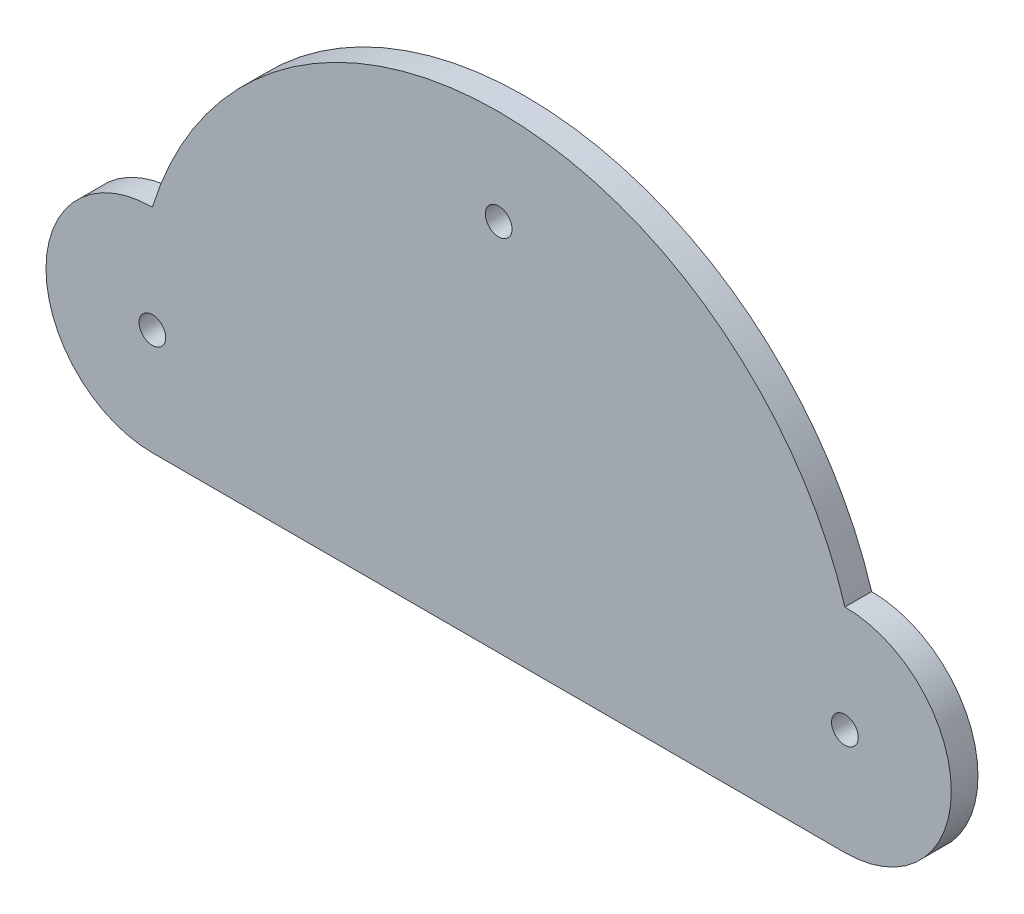
ISO-10303-21;
HEADER;
FILE_DESCRIPTION(('STEP AP214'),'2;1');
FILE_NAME('part.step','',(''),(''),'','','');
FILE_SCHEMA(('AUTOMOTIVE_DESIGN { 1 0 10303 214 1 1 1 1 }'));
ENDSEC;
DATA;
#1=APPLICATION_CONTEXT('core data for automotive mechanical design processes');
#2=APPLICATION_PROTOCOL_DEFINITION('international standard','automotive_design',2000,#1);
#3=PRODUCT_CONTEXT('',#1,'mechanical');
#4=PRODUCT('Part','Part','',(#3));
#5=PRODUCT_RELATED_PRODUCT_CATEGORY('part','',(#4));
#6=PRODUCT_DEFINITION_FORMATION('','',#4);
#7=PRODUCT_DEFINITION_CONTEXT('part definition',#1,'design');
#8=PRODUCT_DEFINITION('design','',#6,#7);
#9=PRODUCT_DEFINITION_SHAPE('','',#8);
#10=(LENGTH_UNIT() NAMED_UNIT(*) SI_UNIT(.MILLI.,.METRE.));
#11=(NAMED_UNIT(*) PLANE_ANGLE_UNIT() SI_UNIT($,.RADIAN.));
#12=(NAMED_UNIT(*) SI_UNIT($,.STERADIAN.) SOLID_ANGLE_UNIT());
#13=UNCERTAINTY_MEASURE_WITH_UNIT(LENGTH_MEASURE(1.E-05),#10,'distance_accuracy_value','');
#14=(GEOMETRIC_REPRESENTATION_CONTEXT(3) GLOBAL_UNCERTAINTY_ASSIGNED_CONTEXT((#13)) GLOBAL_UNIT_ASSIGNED_CONTEXT((#10,
#11,#12)) REPRESENTATION_CONTEXT('',''));
#15=CARTESIAN_POINT('',(0.,0.,0.));
#16=DIRECTION('',(0.,0.,1.));
#17=DIRECTION('',(1.,0.,0.));
#18=AXIS2_PLACEMENT_3D('',#15,#16,#17);
#19=CARTESIAN_POINT('',(38.89,0.,3.));
#20=DIRECTION('',(0.,0.,1.));
#21=DIRECTION('',(1.,0.,0.));
#22=AXIS2_PLACEMENT_3D('',#19,#20,#21);
#23=PLANE('',#22);
#24=CARTESIAN_POINT('',(77.78,0.,3.));
#25=DIRECTION('',(0.,0.,1.));
#26=DIRECTION('',(1.,0.,0.));
#27=AXIS2_PLACEMENT_3D('',#24,#25,#26);
#28=CIRCLE('',#27,1.5);
#29=CARTESIAN_POINT('',(79.28,0.,3.));
#30=VERTEX_POINT('',#29);
#31=EDGE_CURVE('E115',#30,#30,#28,.T.);
#32=ORIENTED_EDGE('',*,*,#31,.F.);
#33=EDGE_LOOP('',(#32));
#34=FACE_BOUND('',#33,.T.);
#35=CARTESIAN_POINT('',(38.89,0.,3.));
#36=DIRECTION('',(0.,0.,1.));
#37=DIRECTION('',(1.,0.,0.));
#38=AXIS2_PLACEMENT_3D('',#35,#36,#37);
#39=CIRCLE('',#38,40.6839116841608);
#40=CARTESIAN_POINT('',(77.78,11.9477432984057,3.));
#41=VERTEX_POINT('',#40);
#42=CARTESIAN_POINT('',(0.,11.9477432984057,3.));
#43=VERTEX_POINT('',#42);
#44=EDGE_CURVE('E85',#41,#43,#39,.T.);
#45=ORIENTED_EDGE('',*,*,#44,.T.);
#46=CARTESIAN_POINT('',(0.,0.,3.));
#47=DIRECTION('',(0.,0.,1.));
#48=DIRECTION('',(1.,0.,0.));
#49=AXIS2_PLACEMENT_3D('',#46,#47,#48);
#50=CIRCLE('',#49,11.9477432984057);
#51=CARTESIAN_POINT('',(0.,-11.9477432984057,3.));
#52=VERTEX_POINT('',#51);
#53=EDGE_CURVE('E80',#43,#52,#50,.T.);
#54=ORIENTED_EDGE('',*,*,#53,.T.);
#55=DIRECTION('',(1.,0.,0.));
#56=VECTOR('',#55,1.);
#57=CARTESIAN_POINT('',(0.,-11.9477432984057,3.));
#58=LINE('',#57,#56);
#59=CARTESIAN_POINT('',(77.78,-11.9477432984057,3.));
#60=VERTEX_POINT('',#59);
#61=EDGE_CURVE('E83',#52,#60,#58,.T.);
#62=ORIENTED_EDGE('',*,*,#61,.T.);
#63=CARTESIAN_POINT('',(77.78,0.,3.));
#64=DIRECTION('',(0.,0.,1.));
#65=DIRECTION('',(1.,0.,0.));
#66=AXIS2_PLACEMENT_3D('',#63,#64,#65);
#67=CIRCLE('',#66,11.9477432984057);
#68=EDGE_CURVE('E50',#60,#41,#67,.T.);
#69=ORIENTED_EDGE('',*,*,#68,.T.);
#70=EDGE_LOOP('',(#45,#54,#62,#69));
#71=FACE_BOUND('',#70,.T.);
#72=CARTESIAN_POINT('',(0.,0.,3.));
#73=DIRECTION('',(0.,0.,1.));
#74=DIRECTION('',(1.,0.,0.));
#75=AXIS2_PLACEMENT_3D('',#72,#73,#74);
#76=CIRCLE('',#75,1.5);
#77=CARTESIAN_POINT('',(1.5,0.,3.));
#78=VERTEX_POINT('',#77);
#79=EDGE_CURVE('E100',#78,#78,#76,.T.);
#80=ORIENTED_EDGE('',*,*,#79,.F.);
#81=EDGE_LOOP('',(#80));
#82=FACE_BOUND('',#81,.T.);
#83=CARTESIAN_POINT('',(38.89,30.,3.));
#84=DIRECTION('',(0.,0.,1.));
#85=DIRECTION('',(1.,0.,0.));
#86=AXIS2_PLACEMENT_3D('',#83,#84,#85);
#87=CIRCLE('',#86,1.5);
#88=CARTESIAN_POINT('',(40.39,30.,3.));
#89=VERTEX_POINT('',#88);
#90=EDGE_CURVE('E121',#89,#89,#87,.T.);
#91=ORIENTED_EDGE('',*,*,#90,.F.);
#92=EDGE_LOOP('',(#91));
#93=FACE_BOUND('',#92,.T.);
#94=ADVANCED_FACE('F33',(#34,#71,#82,#93),#23,.T.);
#95=CARTESIAN_POINT('',(38.89,0.,0.));
#96=DIRECTION('',(0.,0.,1.));
#97=DIRECTION('',(1.,0.,0.));
#98=AXIS2_PLACEMENT_3D('',#95,#96,#97);
#99=PLANE('',#98);
#100=CARTESIAN_POINT('',(38.89,0.,0.));
#101=DIRECTION('',(0.,0.,1.));
#102=DIRECTION('',(1.,0.,0.));
#103=AXIS2_PLACEMENT_3D('',#100,#101,#102);
#104=CIRCLE('',#103,40.6839116841608);
#105=CARTESIAN_POINT('',(77.78,11.9477432984057,0.));
#106=VERTEX_POINT('',#105);
#107=CARTESIAN_POINT('',(0.,11.9477432984057,0.));
#108=VERTEX_POINT('',#107);
#109=EDGE_CURVE('E97',#106,#108,#104,.T.);
#110=ORIENTED_EDGE('',*,*,#109,.F.);
#111=CARTESIAN_POINT('',(77.78,0.,0.));
#112=DIRECTION('',(0.,0.,1.));
#113=DIRECTION('',(1.,0.,0.));
#114=AXIS2_PLACEMENT_3D('',#111,#112,#113);
#115=CIRCLE('',#114,11.9477432984057);
#116=CARTESIAN_POINT('',(77.78,-11.9477432984057,0.));
#117=VERTEX_POINT('',#116);
#118=EDGE_CURVE('E73',#117,#106,#115,.T.);
#119=ORIENTED_EDGE('',*,*,#118,.F.);
#120=DIRECTION('',(1.,0.,0.));
#121=VECTOR('',#120,1.);
#122=CARTESIAN_POINT('',(0.,-11.9477432984057,0.));
#123=LINE('',#122,#121);
#124=CARTESIAN_POINT('',(0.,-11.9477432984057,0.));
#125=VERTEX_POINT('',#124);
#126=EDGE_CURVE('E67',#125,#117,#123,.T.);
#127=ORIENTED_EDGE('',*,*,#126,.F.);
#128=CARTESIAN_POINT('',(0.,0.,0.));
#129=DIRECTION('',(0.,0.,1.));
#130=DIRECTION('',(1.,0.,0.));
#131=AXIS2_PLACEMENT_3D('',#128,#129,#130);
#132=CIRCLE('',#131,11.9477432984057);
#133=EDGE_CURVE('E89',#108,#125,#132,.T.);
#134=ORIENTED_EDGE('',*,*,#133,.F.);
#135=EDGE_LOOP('',(#110,#119,#127,#134));
#136=FACE_BOUND('',#135,.T.);
#137=CARTESIAN_POINT('',(0.,0.,0.));
#138=DIRECTION('',(0.,0.,1.));
#139=DIRECTION('',(1.,0.,0.));
#140=AXIS2_PLACEMENT_3D('',#137,#138,#139);
#141=CIRCLE('',#140,1.5);
#142=CARTESIAN_POINT('',(1.5,0.,0.));
#143=VERTEX_POINT('',#142);
#144=EDGE_CURVE('E112',#143,#143,#141,.T.);
#145=ORIENTED_EDGE('',*,*,#144,.T.);
#146=EDGE_LOOP('',(#145));
#147=FACE_BOUND('',#146,.T.);
#148=CARTESIAN_POINT('',(77.78,0.,0.));
#149=DIRECTION('',(0.,0.,1.));
#150=DIRECTION('',(1.,0.,0.));
#151=AXIS2_PLACEMENT_3D('',#148,#149,#150);
#152=CIRCLE('',#151,1.5);
#153=CARTESIAN_POINT('',(79.28,0.,0.));
#154=VERTEX_POINT('',#153);
#155=EDGE_CURVE('E118',#154,#154,#152,.T.);
#156=ORIENTED_EDGE('',*,*,#155,.T.);
#157=EDGE_LOOP('',(#156));
#158=FACE_BOUND('',#157,.T.);
#159=CARTESIAN_POINT('',(38.89,30.,0.));
#160=DIRECTION('',(0.,0.,1.));
#161=DIRECTION('',(1.,0.,0.));
#162=AXIS2_PLACEMENT_3D('',#159,#160,#161);
#163=CIRCLE('',#162,1.5);
#164=CARTESIAN_POINT('',(40.39,30.,0.));
#165=VERTEX_POINT('',#164);
#166=EDGE_CURVE('E124',#165,#165,#163,.T.);
#167=ORIENTED_EDGE('',*,*,#166,.T.);
#168=EDGE_LOOP('',(#167));
#169=FACE_BOUND('',#168,.T.);
#170=ADVANCED_FACE('F108',(#136,#147,#158,#169),#99,.F.);
#171=CARTESIAN_POINT('',(38.89,0.,3.));
#172=DIRECTION('',(0.,0.,-1.));
#173=DIRECTION('',(-1.,0.,0.));
#174=AXIS2_PLACEMENT_3D('',#171,#172,#173);
#175=CYLINDRICAL_SURFACE('',#174,40.6839116841608);
#176=ORIENTED_EDGE('',*,*,#109,.T.);
#177=DIRECTION('',(0.,0.,-1.));
#178=VECTOR('',#177,1.);
#179=CARTESIAN_POINT('',(0.,11.9477432984057,3.));
#180=LINE('',#179,#178);
#181=EDGE_CURVE('E11',#43,#108,#180,.T.);
#182=ORIENTED_EDGE('',*,*,#181,.F.);
#183=ORIENTED_EDGE('',*,*,#44,.F.);
#184=DIRECTION('',(0.,0.,-1.));
#185=VECTOR('',#184,1.);
#186=CARTESIAN_POINT('',(77.78,11.9477432984057,3.));
#187=LINE('',#186,#185);
#188=EDGE_CURVE('E93',#41,#106,#187,.T.);
#189=ORIENTED_EDGE('',*,*,#188,.T.);
#190=EDGE_LOOP('',(#176,#182,#183,#189));
#191=FACE_BOUND('',#190,.T.);
#192=ADVANCED_FACE('F35',(#191),#175,.T.);
#193=CARTESIAN_POINT('',(0.,0.,3.));
#194=DIRECTION('',(0.,0.,-1.));
#195=DIRECTION('',(-1.,0.,0.));
#196=AXIS2_PLACEMENT_3D('',#193,#194,#195);
#197=CYLINDRICAL_SURFACE('',#196,11.9477432984057);
#198=ORIENTED_EDGE('',*,*,#133,.T.);
#199=DIRECTION('',(0.,0.,-1.));
#200=VECTOR('',#199,1.);
#201=CARTESIAN_POINT('',(0.,-11.9477432984057,3.));
#202=LINE('',#201,#200);
#203=EDGE_CURVE('E42',#52,#125,#202,.T.);
#204=ORIENTED_EDGE('',*,*,#203,.F.);
#205=ORIENTED_EDGE('',*,*,#53,.F.);
#206=ORIENTED_EDGE('',*,*,#181,.T.);
#207=EDGE_LOOP('',(#198,#204,#205,#206));
#208=FACE_BOUND('',#207,.T.);
#209=ADVANCED_FACE('F88',(#208),#197,.T.);
#210=CARTESIAN_POINT('',(0.,-11.9477432984057,3.));
#211=DIRECTION('',(0.,1.,0.));
#212=DIRECTION('',(0.,0.,1.));
#213=AXIS2_PLACEMENT_3D('',#210,#211,#212);
#214=PLANE('',#213);
#215=ORIENTED_EDGE('',*,*,#126,.T.);
#216=DIRECTION('',(0.,0.,-1.));
#217=VECTOR('',#216,1.);
#218=CARTESIAN_POINT('',(77.78,-11.9477432984057,3.));
#219=LINE('',#218,#217);
#220=EDGE_CURVE('E90',#60,#117,#219,.T.);
#221=ORIENTED_EDGE('',*,*,#220,.F.);
#222=ORIENTED_EDGE('',*,*,#61,.F.);
#223=ORIENTED_EDGE('',*,*,#203,.T.);
#224=EDGE_LOOP('',(#215,#221,#222,#223));
#225=FACE_BOUND('',#224,.T.);
#226=ADVANCED_FACE('F91',(#225),#214,.F.);
#227=CARTESIAN_POINT('',(77.78,0.,3.));
#228=DIRECTION('',(0.,0.,-1.));
#229=DIRECTION('',(-1.,0.,0.));
#230=AXIS2_PLACEMENT_3D('',#227,#228,#229);
#231=CYLINDRICAL_SURFACE('',#230,11.9477432984057);
#232=ORIENTED_EDGE('',*,*,#118,.T.);
#233=ORIENTED_EDGE('',*,*,#188,.F.);
#234=ORIENTED_EDGE('',*,*,#68,.F.);
#235=ORIENTED_EDGE('',*,*,#220,.T.);
#236=EDGE_LOOP('',(#232,#233,#234,#235));
#237=FACE_BOUND('',#236,.T.);
#238=ADVANCED_FACE('F105',(#237),#231,.T.);
#239=CARTESIAN_POINT('',(0.,0.,3.));
#240=DIRECTION('',(0.,0.,-1.));
#241=DIRECTION('',(-1.,0.,0.));
#242=AXIS2_PLACEMENT_3D('',#239,#240,#241);
#243=CYLINDRICAL_SURFACE('',#242,1.5);
#244=ORIENTED_EDGE('',*,*,#79,.T.);
#245=EDGE_LOOP('',(#244));
#246=FACE_BOUND('',#245,.T.);
#247=ORIENTED_EDGE('',*,*,#144,.F.);
#248=EDGE_LOOP('',(#247));
#249=FACE_BOUND('',#248,.T.);
#250=ADVANCED_FACE('F142',(#246,#249),#243,.F.);
#251=CARTESIAN_POINT('',(77.78,0.,3.));
#252=DIRECTION('',(0.,0.,-1.));
#253=DIRECTION('',(-1.,0.,0.));
#254=AXIS2_PLACEMENT_3D('',#251,#252,#253);
#255=CYLINDRICAL_SURFACE('',#254,1.5);
#256=ORIENTED_EDGE('',*,*,#31,.T.);
#257=EDGE_LOOP('',(#256));
#258=FACE_BOUND('',#257,.T.);
#259=ORIENTED_EDGE('',*,*,#155,.F.);
#260=EDGE_LOOP('',(#259));
#261=FACE_BOUND('',#260,.T.);
#262=ADVANCED_FACE('F188',(#258,#261),#255,.F.);
#263=CARTESIAN_POINT('',(38.89,30.,3.));
#264=DIRECTION('',(0.,0.,-1.));
#265=DIRECTION('',(-1.,0.,0.));
#266=AXIS2_PLACEMENT_3D('',#263,#264,#265);
#267=CYLINDRICAL_SURFACE('',#266,1.5);
#268=ORIENTED_EDGE('',*,*,#90,.T.);
#269=EDGE_LOOP('',(#268));
#270=FACE_BOUND('',#269,.T.);
#271=ORIENTED_EDGE('',*,*,#166,.F.);
#272=EDGE_LOOP('',(#271));
#273=FACE_BOUND('',#272,.T.);
#274=ADVANCED_FACE('F130',(#270,#273),#267,.F.);
#275=CLOSED_SHELL('',(#94,#170,#192,#209,#226,#238,#250,#262,#274));
#276=MANIFOLD_SOLID_BREP('B2',#275);
#277=ADVANCED_BREP_SHAPE_REPRESENTATION('',(#18,#276),#14);
#278=SHAPE_DEFINITION_REPRESENTATION(#9,#277);
ENDSEC;
END-ISO-10303-21;
